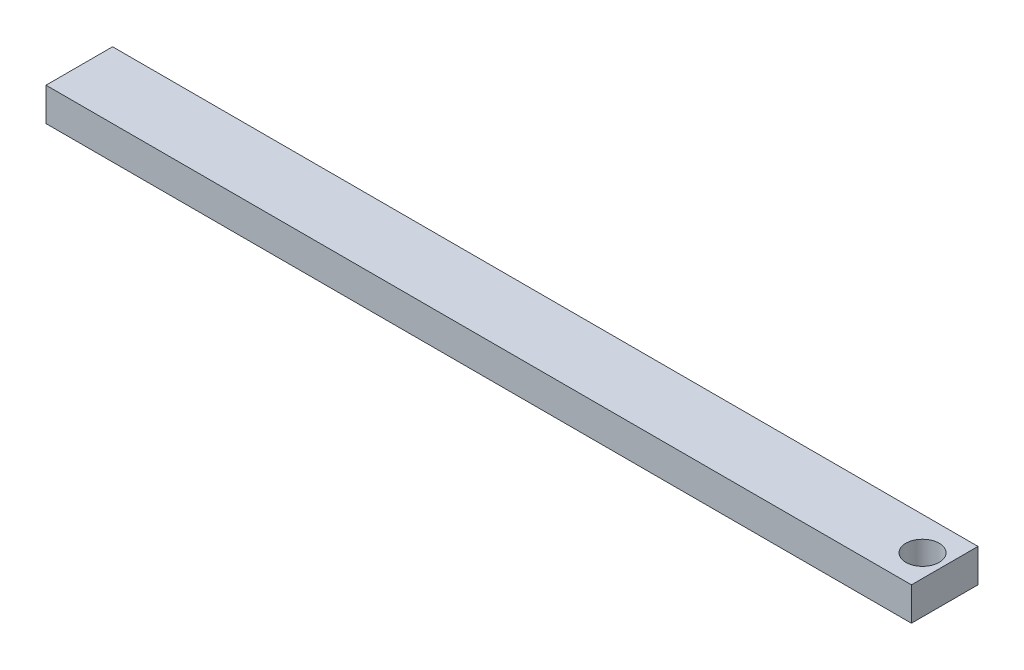
ISO-10303-21;
HEADER;
FILE_DESCRIPTION(('STEP AP214'),'2;1');
FILE_NAME('part.step','',(''),(''),'','','');
FILE_SCHEMA(('AUTOMOTIVE_DESIGN { 1 0 10303 214 1 1 1 1 }'));
ENDSEC;
DATA;
#1=APPLICATION_CONTEXT('core data for automotive mechanical design processes');
#2=APPLICATION_PROTOCOL_DEFINITION('international standard','automotive_design',2000,#1);
#3=PRODUCT_CONTEXT('',#1,'mechanical');
#4=PRODUCT('Part','Part','',(#3));
#5=PRODUCT_RELATED_PRODUCT_CATEGORY('part','',(#4));
#6=PRODUCT_DEFINITION_FORMATION('','',#4);
#7=PRODUCT_DEFINITION_CONTEXT('part definition',#1,'design');
#8=PRODUCT_DEFINITION('design','',#6,#7);
#9=PRODUCT_DEFINITION_SHAPE('','',#8);
#10=(LENGTH_UNIT() NAMED_UNIT(*) SI_UNIT(.MILLI.,.METRE.));
#11=(NAMED_UNIT(*) PLANE_ANGLE_UNIT() SI_UNIT($,.RADIAN.));
#12=(NAMED_UNIT(*) SI_UNIT($,.STERADIAN.) SOLID_ANGLE_UNIT());
#13=UNCERTAINTY_MEASURE_WITH_UNIT(LENGTH_MEASURE(1.E-05),#10,'distance_accuracy_value','');
#14=(GEOMETRIC_REPRESENTATION_CONTEXT(3) GLOBAL_UNCERTAINTY_ASSIGNED_CONTEXT((#13)) GLOBAL_UNIT_ASSIGNED_CONTEXT((#10,
#11,#12)) REPRESENTATION_CONTEXT('',''));
#15=CARTESIAN_POINT('',(0.,0.,0.));
#16=DIRECTION('',(0.,0.,1.));
#17=DIRECTION('',(1.,0.,0.));
#18=AXIS2_PLACEMENT_3D('',#15,#16,#17);
#19=CARTESIAN_POINT('',(80.,-360.,30.));
#20=DIRECTION('',(-1.,0.,0.));
#21=DIRECTION('',(0.,0.,1.));
#22=AXIS2_PLACEMENT_3D('',#19,#20,#21);
#23=PLANE('',#22);
#24=DIRECTION('',(0.,1.,0.));
#25=VECTOR('',#24,1.);
#26=CARTESIAN_POINT('',(80.,-360.,-30.));
#27=LINE('',#26,#25);
#28=CARTESIAN_POINT('',(80.,-390.,-30.));
#29=VERTEX_POINT('',#28);
#30=CARTESIAN_POINT('',(80.,-360.,-30.));
#31=VERTEX_POINT('',#30);
#32=EDGE_CURVE('E77',#29,#31,#27,.T.);
#33=ORIENTED_EDGE('',*,*,#32,.T.);
#34=DIRECTION('',(0.,0.,-1.));
#35=VECTOR('',#34,1.);
#36=CARTESIAN_POINT('',(80.,-360.,30.));
#37=LINE('',#36,#35);
#38=CARTESIAN_POINT('',(80.,-360.,30.));
#39=VERTEX_POINT('',#38);
#40=EDGE_CURVE('E11',#39,#31,#37,.T.);
#41=ORIENTED_EDGE('',*,*,#40,.F.);
#42=DIRECTION('',(0.,1.,0.));
#43=VECTOR('',#42,1.);
#44=CARTESIAN_POINT('',(80.,-360.,30.));
#45=LINE('',#44,#43);
#46=CARTESIAN_POINT('',(80.,-390.,30.));
#47=VERTEX_POINT('',#46);
#48=EDGE_CURVE('E100',#47,#39,#45,.T.);
#49=ORIENTED_EDGE('',*,*,#48,.F.);
#50=DIRECTION('',(0.,0.,-1.));
#51=VECTOR('',#50,1.);
#52=CARTESIAN_POINT('',(80.,-390.,30.));
#53=LINE('',#52,#51);
#54=EDGE_CURVE('E89',#47,#29,#53,.T.);
#55=ORIENTED_EDGE('',*,*,#54,.T.);
#56=EDGE_LOOP('',(#33,#41,#49,#55));
#57=FACE_BOUND('',#56,.T.);
#58=ADVANCED_FACE('F33',(#57),#23,.F.);
#59=CARTESIAN_POINT('',(80.,-360.,30.));
#60=DIRECTION('',(0.,-1.,0.));
#61=DIRECTION('',(0.,0.,-1.));
#62=AXIS2_PLACEMENT_3D('',#59,#60,#61);
#63=PLANE('',#62);
#64=CARTESIAN_POINT('',(60.,-360.,0.));
#65=DIRECTION('',(0.,1.,0.));
#66=DIRECTION('',(0.,0.,1.));
#67=AXIS2_PLACEMENT_3D('',#64,#65,#66);
#68=CIRCLE('',#67,15.);
#69=CARTESIAN_POINT('',(60.,-360.,15.));
#70=VERTEX_POINT('',#69);
#71=EDGE_CURVE('E93',#70,#70,#68,.T.);
#72=ORIENTED_EDGE('',*,*,#71,.F.);
#73=EDGE_LOOP('',(#72));
#74=FACE_BOUND('',#73,.T.);
#75=DIRECTION('',(-1.,0.,0.));
#76=VECTOR('',#75,1.);
#77=CARTESIAN_POINT('',(80.,-360.,-30.));
#78=LINE('',#77,#76);
#79=CARTESIAN_POINT('',(-700.,-360.,-30.));
#80=VERTEX_POINT('',#79);
#81=EDGE_CURVE('E73',#31,#80,#78,.T.);
#82=ORIENTED_EDGE('',*,*,#81,.T.);
#83=DIRECTION('',(0.,0.,-1.));
#84=VECTOR('',#83,1.);
#85=CARTESIAN_POINT('',(-700.,-360.,30.));
#86=LINE('',#85,#84);
#87=CARTESIAN_POINT('',(-700.,-360.,30.));
#88=VERTEX_POINT('',#87);
#89=EDGE_CURVE('E40',#88,#80,#86,.T.);
#90=ORIENTED_EDGE('',*,*,#89,.F.);
#91=DIRECTION('',(-1.,0.,0.));
#92=VECTOR('',#91,1.);
#93=CARTESIAN_POINT('',(80.,-360.,30.));
#94=LINE('',#93,#92);
#95=EDGE_CURVE('E85',#39,#88,#94,.T.);
#96=ORIENTED_EDGE('',*,*,#95,.F.);
#97=ORIENTED_EDGE('',*,*,#40,.T.);
#98=EDGE_LOOP('',(#82,#90,#96,#97));
#99=FACE_BOUND('',#98,.T.);
#100=ADVANCED_FACE('F84',(#74,#99),#63,.F.);
#101=CARTESIAN_POINT('',(-700.,-360.,30.));
#102=DIRECTION('',(1.,0.,0.));
#103=DIRECTION('',(0.,0.,-1.));
#104=AXIS2_PLACEMENT_3D('',#101,#102,#103);
#105=PLANE('',#104);
#106=DIRECTION('',(0.,-1.,0.));
#107=VECTOR('',#106,1.);
#108=CARTESIAN_POINT('',(-700.,-360.,-30.));
#109=LINE('',#108,#107);
#110=CARTESIAN_POINT('',(-700.,-390.,-30.));
#111=VERTEX_POINT('',#110);
#112=EDGE_CURVE('E78',#80,#111,#109,.T.);
#113=ORIENTED_EDGE('',*,*,#112,.T.);
#114=DIRECTION('',(0.,0.,-1.));
#115=VECTOR('',#114,1.);
#116=CARTESIAN_POINT('',(-700.,-390.,30.));
#117=LINE('',#116,#115);
#118=CARTESIAN_POINT('',(-700.,-390.,30.));
#119=VERTEX_POINT('',#118);
#120=EDGE_CURVE('E106',#119,#111,#117,.T.);
#121=ORIENTED_EDGE('',*,*,#120,.F.);
#122=DIRECTION('',(0.,-1.,0.));
#123=VECTOR('',#122,1.);
#124=CARTESIAN_POINT('',(-700.,-360.,30.));
#125=LINE('',#124,#123);
#126=EDGE_CURVE('E52',#88,#119,#125,.T.);
#127=ORIENTED_EDGE('',*,*,#126,.F.);
#128=ORIENTED_EDGE('',*,*,#89,.T.);
#129=EDGE_LOOP('',(#113,#121,#127,#128));
#130=FACE_BOUND('',#129,.T.);
#131=ADVANCED_FACE('F109',(#130),#105,.F.);
#132=CARTESIAN_POINT('',(80.,-390.,30.));
#133=DIRECTION('',(0.,1.,0.));
#134=DIRECTION('',(0.,0.,1.));
#135=AXIS2_PLACEMENT_3D('',#132,#133,#134);
#136=PLANE('',#135);
#137=CARTESIAN_POINT('',(60.,-390.,0.));
#138=DIRECTION('',(0.,1.,0.));
#139=DIRECTION('',(0.,0.,1.));
#140=AXIS2_PLACEMENT_3D('',#137,#138,#139);
#141=CIRCLE('',#140,15.);
#142=CARTESIAN_POINT('',(60.,-390.,15.));
#143=VERTEX_POINT('',#142);
#144=EDGE_CURVE('E90',#143,#143,#141,.T.);
#145=ORIENTED_EDGE('',*,*,#144,.T.);
#146=EDGE_LOOP('',(#145));
#147=FACE_BOUND('',#146,.T.);
#148=DIRECTION('',(1.,0.,0.));
#149=VECTOR('',#148,1.);
#150=CARTESIAN_POINT('',(80.,-390.,-30.));
#151=LINE('',#150,#149);
#152=EDGE_CURVE('E98',#111,#29,#151,.T.);
#153=ORIENTED_EDGE('',*,*,#152,.T.);
#154=ORIENTED_EDGE('',*,*,#54,.F.);
#155=DIRECTION('',(1.,0.,0.));
#156=VECTOR('',#155,1.);
#157=CARTESIAN_POINT('',(80.,-390.,30.));
#158=LINE('',#157,#156);
#159=EDGE_CURVE('E47',#119,#47,#158,.T.);
#160=ORIENTED_EDGE('',*,*,#159,.F.);
#161=ORIENTED_EDGE('',*,*,#120,.T.);
#162=EDGE_LOOP('',(#153,#154,#160,#161));
#163=FACE_BOUND('',#162,.T.);
#164=ADVANCED_FACE('F111',(#147,#163),#136,.F.);
#165=CARTESIAN_POINT('',(80.,-390.,30.));
#166=DIRECTION('',(0.,0.,-1.));
#167=DIRECTION('',(-1.,0.,0.));
#168=AXIS2_PLACEMENT_3D('',#165,#166,#167);
#169=PLANE('',#168);
#170=ORIENTED_EDGE('',*,*,#48,.T.);
#171=ORIENTED_EDGE('',*,*,#95,.T.);
#172=ORIENTED_EDGE('',*,*,#126,.T.);
#173=ORIENTED_EDGE('',*,*,#159,.T.);
#174=EDGE_LOOP('',(#170,#171,#172,#173));
#175=FACE_BOUND('',#174,.T.);
#176=ADVANCED_FACE('F112',(#175),#169,.F.);
#177=CARTESIAN_POINT('',(80.,-390.,-30.));
#178=DIRECTION('',(0.,0.,-1.));
#179=DIRECTION('',(-1.,0.,0.));
#180=AXIS2_PLACEMENT_3D('',#177,#178,#179);
#181=PLANE('',#180);
#182=ORIENTED_EDGE('',*,*,#32,.F.);
#183=ORIENTED_EDGE('',*,*,#152,.F.);
#184=ORIENTED_EDGE('',*,*,#112,.F.);
#185=ORIENTED_EDGE('',*,*,#81,.F.);
#186=EDGE_LOOP('',(#182,#183,#184,#185));
#187=FACE_BOUND('',#186,.T.);
#188=ADVANCED_FACE('F74',(#187),#181,.T.);
#189=CARTESIAN_POINT('',(60.,-390.,0.));
#190=DIRECTION('',(0.,1.,0.));
#191=DIRECTION('',(0.,0.,1.));
#192=AXIS2_PLACEMENT_3D('',#189,#190,#191);
#193=CYLINDRICAL_SURFACE('',#192,15.);
#194=ORIENTED_EDGE('',*,*,#144,.F.);
#195=EDGE_LOOP('',(#194));
#196=FACE_BOUND('',#195,.T.);
#197=ORIENTED_EDGE('',*,*,#71,.T.);
#198=EDGE_LOOP('',(#197));
#199=FACE_BOUND('',#198,.T.);
#200=ADVANCED_FACE('F119',(#196,#199),#193,.F.);
#201=CLOSED_SHELL('',(#58,#100,#131,#164,#176,#188,#200));
#202=MANIFOLD_SOLID_BREP('B2',#201);
#203=ADVANCED_BREP_SHAPE_REPRESENTATION('',(#18,#202),#14);
#204=SHAPE_DEFINITION_REPRESENTATION(#9,#203);
ENDSEC;
END-ISO-10303-21;
